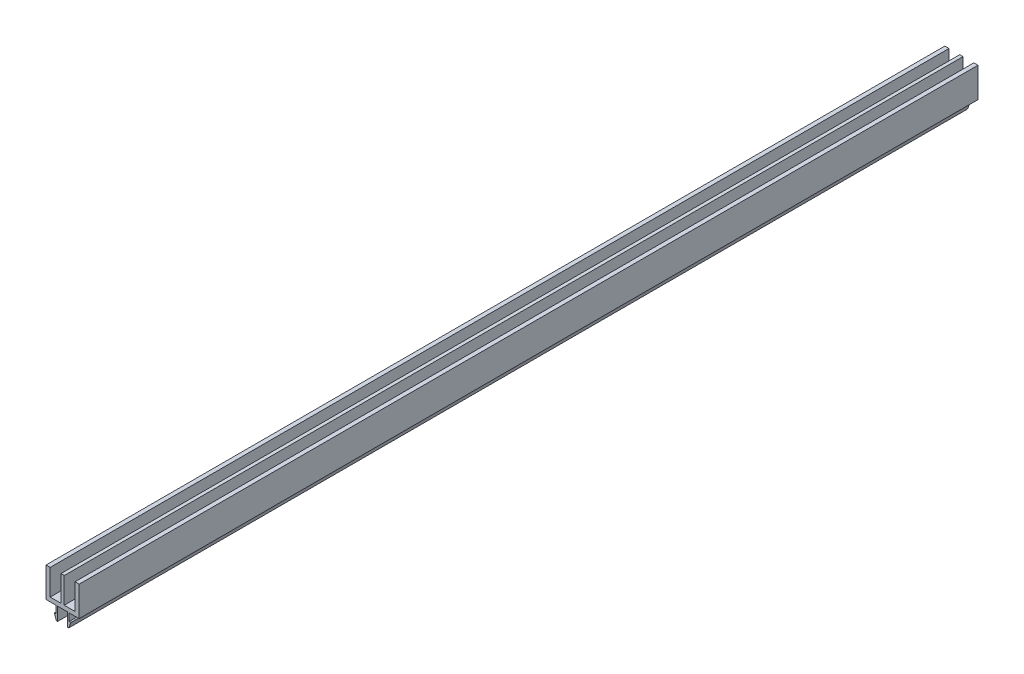
ISO-10303-21;
HEADER;
FILE_DESCRIPTION(('STEP AP214'),'2;1');
FILE_NAME('part.step','',(''),(''),'','','');
FILE_SCHEMA(('AUTOMOTIVE_DESIGN { 1 0 10303 214 1 1 1 1 }'));
ENDSEC;
DATA;
#1=APPLICATION_CONTEXT('core data for automotive mechanical design processes');
#2=APPLICATION_PROTOCOL_DEFINITION('international standard','automotive_design',2000,#1);
#3=PRODUCT_CONTEXT('',#1,'mechanical');
#4=PRODUCT('Part','Part','',(#3));
#5=PRODUCT_RELATED_PRODUCT_CATEGORY('part','',(#4));
#6=PRODUCT_DEFINITION_FORMATION('','',#4);
#7=PRODUCT_DEFINITION_CONTEXT('part definition',#1,'design');
#8=PRODUCT_DEFINITION('design','',#6,#7);
#9=PRODUCT_DEFINITION_SHAPE('','',#8);
#10=(LENGTH_UNIT() NAMED_UNIT(*) SI_UNIT(.MILLI.,.METRE.));
#11=(NAMED_UNIT(*) PLANE_ANGLE_UNIT() SI_UNIT($,.RADIAN.));
#12=(NAMED_UNIT(*) SI_UNIT($,.STERADIAN.) SOLID_ANGLE_UNIT());
#13=UNCERTAINTY_MEASURE_WITH_UNIT(LENGTH_MEASURE(1.E-05),#10,'distance_accuracy_value','');
#14=(GEOMETRIC_REPRESENTATION_CONTEXT(3) GLOBAL_UNCERTAINTY_ASSIGNED_CONTEXT((#13)) GLOBAL_UNIT_ASSIGNED_CONTEXT((#10,
#11,#12)) REPRESENTATION_CONTEXT('',''));
#15=CARTESIAN_POINT('',(0.,0.,0.));
#16=DIRECTION('',(0.,0.,1.));
#17=DIRECTION('',(1.,0.,0.));
#18=AXIS2_PLACEMENT_3D('',#15,#16,#17);
#19=CARTESIAN_POINT('',(-1.,17.9999999975,-492.));
#20=DIRECTION('',(-1.,0.,0.));
#21=DIRECTION('',(0.,-1.,0.));
#22=AXIS2_PLACEMENT_3D('',#19,#20,#21);
#23=PLANE('',#22);
#24=DIRECTION('',(0.,-1.,0.));
#25=VECTOR('',#24,1.);
#26=CARTESIAN_POINT('',(-1.,17.9999999975,50.));
#27=LINE('',#26,#25);
#28=CARTESIAN_POINT('',(-1.,17.9999999975,50.));
#29=VERTEX_POINT('',#28);
#30=CARTESIAN_POINT('',(-1.,2.4999999995,50.));
#31=VERTEX_POINT('',#30);
#32=EDGE_CURVE('E225',#29,#31,#27,.T.);
#33=ORIENTED_EDGE('',*,*,#32,.F.);
#34=DIRECTION('',(0.,0.,1.));
#35=VECTOR('',#34,1.);
#36=CARTESIAN_POINT('',(-1.,17.9999999975,-492.));
#37=LINE('',#36,#35);
#38=CARTESIAN_POINT('',(-1.,17.9999999975,-492.));
#39=VERTEX_POINT('',#38);
#40=EDGE_CURVE('E11',#39,#29,#37,.T.);
#41=ORIENTED_EDGE('',*,*,#40,.F.);
#42=DIRECTION('',(0.,-1.,0.));
#43=VECTOR('',#42,1.);
#44=CARTESIAN_POINT('',(-1.,17.9999999975,-492.));
#45=LINE('',#44,#43);
#46=CARTESIAN_POINT('',(-1.,2.4999999995,-492.));
#47=VERTEX_POINT('',#46);
#48=EDGE_CURVE('E293',#39,#47,#45,.T.);
#49=ORIENTED_EDGE('',*,*,#48,.T.);
#50=DIRECTION('',(0.,0.,1.));
#51=VECTOR('',#50,1.);
#52=CARTESIAN_POINT('',(-1.,2.4999999995,-492.));
#53=LINE('',#52,#51);
#54=EDGE_CURVE('E35',#47,#31,#53,.T.);
#55=ORIENTED_EDGE('',*,*,#54,.T.);
#56=EDGE_LOOP('',(#33,#41,#49,#55));
#57=FACE_BOUND('',#56,.T.);
#58=ADVANCED_FACE('F32',(#57),#23,.T.);
#59=CARTESIAN_POINT('',(0.999999999999998,17.9999999975,-492.));
#60=DIRECTION('',(0.,1.,0.));
#61=DIRECTION('',(0.,0.,1.));
#62=AXIS2_PLACEMENT_3D('',#59,#60,#61);
#63=PLANE('',#62);
#64=DIRECTION('',(-1.,0.,0.));
#65=VECTOR('',#64,1.);
#66=CARTESIAN_POINT('',(0.999999999999998,17.9999999975,50.));
#67=LINE('',#66,#65);
#68=CARTESIAN_POINT('',(0.999999999999998,17.9999999975,50.));
#69=VERTEX_POINT('',#68);
#70=EDGE_CURVE('E291',#69,#29,#67,.T.);
#71=ORIENTED_EDGE('',*,*,#70,.F.);
#72=DIRECTION('',(0.,0.,1.));
#73=VECTOR('',#72,1.);
#74=CARTESIAN_POINT('',(0.999999999999998,17.9999999975,-492.));
#75=LINE('',#74,#73);
#76=CARTESIAN_POINT('',(0.999999999999998,17.9999999975,-492.));
#77=VERTEX_POINT('',#76);
#78=EDGE_CURVE('E41',#77,#69,#75,.T.);
#79=ORIENTED_EDGE('',*,*,#78,.F.);
#80=DIRECTION('',(-1.,0.,0.));
#81=VECTOR('',#80,1.);
#82=CARTESIAN_POINT('',(0.999999999999998,17.9999999975,-492.));
#83=LINE('',#82,#81);
#84=EDGE_CURVE('E215',#77,#39,#83,.T.);
#85=ORIENTED_EDGE('',*,*,#84,.T.);
#86=ORIENTED_EDGE('',*,*,#40,.T.);
#87=EDGE_LOOP('',(#71,#79,#85,#86));
#88=FACE_BOUND('',#87,.T.);
#89=ADVANCED_FACE('F337',(#88),#63,.T.);
#90=CARTESIAN_POINT('',(0.999999999999998,2.4999999995,-492.));
#91=DIRECTION('',(1.,0.,0.));
#92=DIRECTION('',(0.,0.,-1.));
#93=AXIS2_PLACEMENT_3D('',#90,#91,#92);
#94=PLANE('',#93);
#95=DIRECTION('',(0.,1.,0.));
#96=VECTOR('',#95,1.);
#97=CARTESIAN_POINT('',(0.999999999999998,2.4999999995,50.));
#98=LINE('',#97,#96);
#99=CARTESIAN_POINT('',(0.999999999999998,2.4999999995,50.));
#100=VERTEX_POINT('',#99);
#101=EDGE_CURVE('E202',#100,#69,#98,.T.);
#102=ORIENTED_EDGE('',*,*,#101,.F.);
#103=DIRECTION('',(0.,0.,1.));
#104=VECTOR('',#103,1.);
#105=CARTESIAN_POINT('',(0.999999999999998,2.4999999995,-492.));
#106=LINE('',#105,#104);
#107=CARTESIAN_POINT('',(0.999999999999998,2.4999999995,-492.));
#108=VERTEX_POINT('',#107);
#109=EDGE_CURVE('E197',#108,#100,#106,.T.);
#110=ORIENTED_EDGE('',*,*,#109,.F.);
#111=DIRECTION('',(0.,1.,0.));
#112=VECTOR('',#111,1.);
#113=CARTESIAN_POINT('',(0.999999999999998,2.4999999995,-492.));
#114=LINE('',#113,#112);
#115=EDGE_CURVE('E200',#108,#77,#114,.T.);
#116=ORIENTED_EDGE('',*,*,#115,.T.);
#117=ORIENTED_EDGE('',*,*,#78,.T.);
#118=EDGE_LOOP('',(#102,#110,#116,#117));
#119=FACE_BOUND('',#118,.T.);
#120=ADVANCED_FACE('F199',(#119),#94,.T.);
#121=CARTESIAN_POINT('',(7.5,2.4999999995,-492.));
#122=DIRECTION('',(0.,1.,0.));
#123=DIRECTION('',(-1.,0.,0.));
#124=AXIS2_PLACEMENT_3D('',#121,#122,#123);
#125=PLANE('',#124);
#126=DIRECTION('',(-1.,0.,0.));
#127=VECTOR('',#126,1.);
#128=CARTESIAN_POINT('',(7.5,2.4999999995,50.));
#129=LINE('',#128,#127);
#130=CARTESIAN_POINT('',(7.5,2.4999999995,50.));
#131=VERTEX_POINT('',#130);
#132=EDGE_CURVE('E288',#131,#100,#129,.T.);
#133=ORIENTED_EDGE('',*,*,#132,.F.);
#134=DIRECTION('',(0.,0.,1.));
#135=VECTOR('',#134,1.);
#136=CARTESIAN_POINT('',(7.5,2.4999999995,-492.));
#137=LINE('',#136,#135);
#138=CARTESIAN_POINT('',(7.5,2.4999999995,-492.));
#139=VERTEX_POINT('',#138);
#140=EDGE_CURVE('E207',#139,#131,#137,.T.);
#141=ORIENTED_EDGE('',*,*,#140,.F.);
#142=DIRECTION('',(-1.,0.,0.));
#143=VECTOR('',#142,1.);
#144=CARTESIAN_POINT('',(7.5,2.4999999995,-492.));
#145=LINE('',#144,#143);
#146=EDGE_CURVE('E213',#139,#108,#145,.T.);
#147=ORIENTED_EDGE('',*,*,#146,.T.);
#148=ORIENTED_EDGE('',*,*,#109,.T.);
#149=EDGE_LOOP('',(#133,#141,#147,#148));
#150=FACE_BOUND('',#149,.T.);
#151=ADVANCED_FACE('F217',(#150),#125,.T.);
#152=CARTESIAN_POINT('',(7.5,17.9999999975,-492.));
#153=DIRECTION('',(-1.,0.,0.));
#154=DIRECTION('',(0.,-1.,0.));
#155=AXIS2_PLACEMENT_3D('',#152,#153,#154);
#156=PLANE('',#155);
#157=DIRECTION('',(0.,-1.,0.));
#158=VECTOR('',#157,1.);
#159=CARTESIAN_POINT('',(7.5,17.9999999975,50.));
#160=LINE('',#159,#158);
#161=CARTESIAN_POINT('',(7.5,17.9999999975,50.));
#162=VERTEX_POINT('',#161);
#163=EDGE_CURVE('E285',#162,#131,#160,.T.);
#164=ORIENTED_EDGE('',*,*,#163,.F.);
#165=DIRECTION('',(0.,0.,1.));
#166=VECTOR('',#165,1.);
#167=CARTESIAN_POINT('',(7.5,17.9999999975,-492.));
#168=LINE('',#167,#166);
#169=CARTESIAN_POINT('',(7.5,17.9999999975,-492.));
#170=VERTEX_POINT('',#169);
#171=EDGE_CURVE('E297',#170,#162,#168,.T.);
#172=ORIENTED_EDGE('',*,*,#171,.F.);
#173=DIRECTION('',(0.,-1.,0.));
#174=VECTOR('',#173,1.);
#175=CARTESIAN_POINT('',(7.5,17.9999999975,-492.));
#176=LINE('',#175,#174);
#177=EDGE_CURVE('E218',#170,#139,#176,.T.);
#178=ORIENTED_EDGE('',*,*,#177,.T.);
#179=ORIENTED_EDGE('',*,*,#140,.T.);
#180=EDGE_LOOP('',(#164,#172,#178,#179));
#181=FACE_BOUND('',#180,.T.);
#182=ADVANCED_FACE('F350',(#181),#156,.T.);
#183=CARTESIAN_POINT('',(10.,17.9999999975,-492.));
#184=DIRECTION('',(0.,1.,0.));
#185=DIRECTION('',(0.,0.,1.));
#186=AXIS2_PLACEMENT_3D('',#183,#184,#185);
#187=PLANE('',#186);
#188=DIRECTION('',(-1.,0.,0.));
#189=VECTOR('',#188,1.);
#190=CARTESIAN_POINT('',(10.,17.9999999975,50.));
#191=LINE('',#190,#189);
#192=CARTESIAN_POINT('',(10.,17.9999999975,50.));
#193=VERTEX_POINT('',#192);
#194=EDGE_CURVE('E282',#193,#162,#191,.T.);
#195=ORIENTED_EDGE('',*,*,#194,.F.);
#196=DIRECTION('',(0.,0.,1.));
#197=VECTOR('',#196,1.);
#198=CARTESIAN_POINT('',(10.,17.9999999975,-492.));
#199=LINE('',#198,#197);
#200=CARTESIAN_POINT('',(10.,17.9999999975,-492.));
#201=VERTEX_POINT('',#200);
#202=EDGE_CURVE('E299',#201,#193,#199,.T.);
#203=ORIENTED_EDGE('',*,*,#202,.F.);
#204=DIRECTION('',(-1.,0.,0.));
#205=VECTOR('',#204,1.);
#206=CARTESIAN_POINT('',(10.,17.9999999975,-492.));
#207=LINE('',#206,#205);
#208=EDGE_CURVE('E220',#201,#170,#207,.T.);
#209=ORIENTED_EDGE('',*,*,#208,.T.);
#210=ORIENTED_EDGE('',*,*,#171,.T.);
#211=EDGE_LOOP('',(#195,#203,#209,#210));
#212=FACE_BOUND('',#211,.T.);
#213=ADVANCED_FACE('F353',(#212),#187,.T.);
#214=CARTESIAN_POINT('',(10.,-4.99999828349541E-10,-492.));
#215=DIRECTION('',(1.,0.,0.));
#216=DIRECTION('',(0.,0.,-1.));
#217=AXIS2_PLACEMENT_3D('',#214,#215,#216);
#218=PLANE('',#217);
#219=DIRECTION('',(0.,1.,0.));
#220=VECTOR('',#219,1.);
#221=CARTESIAN_POINT('',(10.,-4.99999828349541E-10,50.));
#222=LINE('',#221,#220);
#223=CARTESIAN_POINT('',(10.,-4.99999828349541E-10,50.));
#224=VERTEX_POINT('',#223);
#225=EDGE_CURVE('E279',#224,#193,#222,.T.);
#226=ORIENTED_EDGE('',*,*,#225,.F.);
#227=DIRECTION('',(0.,0.,1.));
#228=VECTOR('',#227,1.);
#229=CARTESIAN_POINT('',(10.,-4.99999828349541E-10,-492.));
#230=LINE('',#229,#228);
#231=CARTESIAN_POINT('',(10.,-4.99999828349541E-10,-492.));
#232=VERTEX_POINT('',#231);
#233=EDGE_CURVE('E301',#232,#224,#230,.T.);
#234=ORIENTED_EDGE('',*,*,#233,.F.);
#235=DIRECTION('',(0.,1.,0.));
#236=VECTOR('',#235,1.);
#237=CARTESIAN_POINT('',(10.,-4.99999828349541E-10,-492.));
#238=LINE('',#237,#236);
#239=EDGE_CURVE('E643',#232,#201,#238,.T.);
#240=ORIENTED_EDGE('',*,*,#239,.T.);
#241=ORIENTED_EDGE('',*,*,#202,.T.);
#242=EDGE_LOOP('',(#226,#234,#240,#241));
#243=FACE_BOUND('',#242,.T.);
#244=ADVANCED_FACE('F357',(#243),#218,.T.);
#245=CARTESIAN_POINT('',(4.,-4.99999998002099E-10,-492.));
#246=DIRECTION('',(0.,-1.,0.));
#247=DIRECTION('',(1.,0.,0.));
#248=AXIS2_PLACEMENT_3D('',#245,#246,#247);
#249=PLANE('',#248);
#250=DIRECTION('',(1.,0.,0.));
#251=VECTOR('',#250,1.);
#252=CARTESIAN_POINT('',(4.,-4.99999998002099E-10,50.));
#253=LINE('',#252,#251);
#254=CARTESIAN_POINT('',(4.,-4.99999998002099E-10,50.));
#255=VERTEX_POINT('',#254);
#256=EDGE_CURVE('E276',#255,#224,#253,.T.);
#257=ORIENTED_EDGE('',*,*,#256,.F.);
#258=DIRECTION('',(0.,0.,1.));
#259=VECTOR('',#258,1.);
#260=CARTESIAN_POINT('',(4.,-4.99999998002099E-10,-492.));
#261=LINE('',#260,#259);
#262=CARTESIAN_POINT('',(4.,-4.99999998002099E-10,-492.));
#263=VERTEX_POINT('',#262);
#264=EDGE_CURVE('E303',#263,#255,#261,.T.);
#265=ORIENTED_EDGE('',*,*,#264,.F.);
#266=DIRECTION('',(1.,0.,0.));
#267=VECTOR('',#266,1.);
#268=CARTESIAN_POINT('',(4.,-4.99999998002099E-10,-492.));
#269=LINE('',#268,#267);
#270=EDGE_CURVE('E647',#263,#232,#269,.T.);
#271=ORIENTED_EDGE('',*,*,#270,.T.);
#272=ORIENTED_EDGE('',*,*,#233,.T.);
#273=EDGE_LOOP('',(#257,#265,#271,#272));
#274=FACE_BOUND('',#273,.T.);
#275=ADVANCED_FACE('F361',(#274),#249,.T.);
#276=CARTESIAN_POINT('',(4.,-4.5,-492.));
#277=DIRECTION('',(1.,0.,0.));
#278=DIRECTION('',(0.,0.,-1.));
#279=AXIS2_PLACEMENT_3D('',#276,#277,#278);
#280=PLANE('',#279);
#281=DIRECTION('',(0.,1.,0.));
#282=VECTOR('',#281,1.);
#283=CARTESIAN_POINT('',(4.,-4.5,50.));
#284=LINE('',#283,#282);
#285=CARTESIAN_POINT('',(4.,-4.5,50.));
#286=VERTEX_POINT('',#285);
#287=EDGE_CURVE('E273',#286,#255,#284,.T.);
#288=ORIENTED_EDGE('',*,*,#287,.F.);
#289=DIRECTION('',(0.,0.,1.));
#290=VECTOR('',#289,1.);
#291=CARTESIAN_POINT('',(4.,-4.5,-492.));
#292=LINE('',#291,#290);
#293=CARTESIAN_POINT('',(4.,-4.5,-492.));
#294=VERTEX_POINT('',#293);
#295=EDGE_CURVE('E305',#294,#286,#292,.T.);
#296=ORIENTED_EDGE('',*,*,#295,.F.);
#297=DIRECTION('',(0.,1.,0.));
#298=VECTOR('',#297,1.);
#299=CARTESIAN_POINT('',(4.,-4.5,-492.));
#300=LINE('',#299,#298);
#301=EDGE_CURVE('E636',#294,#263,#300,.T.);
#302=ORIENTED_EDGE('',*,*,#301,.T.);
#303=ORIENTED_EDGE('',*,*,#264,.T.);
#304=EDGE_LOOP('',(#288,#296,#302,#303));
#305=FACE_BOUND('',#304,.T.);
#306=ADVANCED_FACE('F365',(#305),#280,.T.);
#307=CARTESIAN_POINT('',(5.,-4.5,-492.));
#308=DIRECTION('',(0.,1.,0.));
#309=DIRECTION('',(0.,0.,1.));
#310=AXIS2_PLACEMENT_3D('',#307,#308,#309);
#311=PLANE('',#310);
#312=DIRECTION('',(-1.,0.,0.));
#313=VECTOR('',#312,1.);
#314=CARTESIAN_POINT('',(5.,-4.5,50.));
#315=LINE('',#314,#313);
#316=CARTESIAN_POINT('',(5.,-4.5,50.));
#317=VERTEX_POINT('',#316);
#318=EDGE_CURVE('E270',#317,#286,#315,.T.);
#319=ORIENTED_EDGE('',*,*,#318,.F.);
#320=DIRECTION('',(0.,0.,1.));
#321=VECTOR('',#320,1.);
#322=CARTESIAN_POINT('',(5.,-4.5,-492.));
#323=LINE('',#322,#321);
#324=CARTESIAN_POINT('',(5.,-4.5,-492.));
#325=VERTEX_POINT('',#324);
#326=EDGE_CURVE('E307',#325,#317,#323,.T.);
#327=ORIENTED_EDGE('',*,*,#326,.F.);
#328=DIRECTION('',(-1.,0.,0.));
#329=VECTOR('',#328,1.);
#330=CARTESIAN_POINT('',(5.,-4.5,-492.));
#331=LINE('',#330,#329);
#332=EDGE_CURVE('E632',#325,#294,#331,.T.);
#333=ORIENTED_EDGE('',*,*,#332,.T.);
#334=ORIENTED_EDGE('',*,*,#295,.T.);
#335=EDGE_LOOP('',(#319,#327,#333,#334));
#336=FACE_BOUND('',#335,.T.);
#337=ADVANCED_FACE('F369',(#336),#311,.T.);
#338=CARTESIAN_POINT('',(3.75,-8.,-492.));
#339=DIRECTION('',(0.941741911594837,-0.336336396998156,0.));
#340=DIRECTION('',(0.336336396998157,0.941741911594838,0.));
#341=AXIS2_PLACEMENT_3D('',#338,#339,#340);
#342=PLANE('',#341);
#343=DIRECTION('',(0.336336396998157,0.941741911594837,0.));
#344=VECTOR('',#343,1.);
#345=CARTESIAN_POINT('',(3.75,-8.,50.));
#346=LINE('',#345,#344);
#347=CARTESIAN_POINT('',(3.75,-8.,50.));
#348=VERTEX_POINT('',#347);
#349=EDGE_CURVE('E267',#348,#317,#346,.T.);
#350=ORIENTED_EDGE('',*,*,#349,.F.);
#351=DIRECTION('',(0.,0.,1.));
#352=VECTOR('',#351,1.);
#353=CARTESIAN_POINT('',(3.75,-8.,-492.));
#354=LINE('',#353,#352);
#355=CARTESIAN_POINT('',(3.75,-8.,-492.));
#356=VERTEX_POINT('',#355);
#357=EDGE_CURVE('E309',#356,#348,#354,.T.);
#358=ORIENTED_EDGE('',*,*,#357,.F.);
#359=DIRECTION('',(0.336336396998157,0.941741911594837,0.));
#360=VECTOR('',#359,1.);
#361=CARTESIAN_POINT('',(3.75,-8.,-492.));
#362=LINE('',#361,#360);
#363=EDGE_CURVE('E653',#356,#325,#362,.T.);
#364=ORIENTED_EDGE('',*,*,#363,.T.);
#365=ORIENTED_EDGE('',*,*,#326,.T.);
#366=EDGE_LOOP('',(#350,#358,#364,#365));
#367=FACE_BOUND('',#366,.T.);
#368=ADVANCED_FACE('F373',(#367),#342,.T.);
#369=CARTESIAN_POINT('',(3.,-8.,-492.));
#370=DIRECTION('',(0.,-1.,0.));
#371=DIRECTION('',(0.,0.,-1.));
#372=AXIS2_PLACEMENT_3D('',#369,#370,#371);
#373=PLANE('',#372);
#374=DIRECTION('',(1.,0.,0.));
#375=VECTOR('',#374,1.);
#376=CARTESIAN_POINT('',(3.,-8.,50.));
#377=LINE('',#376,#375);
#378=CARTESIAN_POINT('',(3.,-8.,50.));
#379=VERTEX_POINT('',#378);
#380=EDGE_CURVE('E264',#379,#348,#377,.T.);
#381=ORIENTED_EDGE('',*,*,#380,.F.);
#382=DIRECTION('',(0.,0.,1.));
#383=VECTOR('',#382,1.);
#384=CARTESIAN_POINT('',(3.,-8.,-492.));
#385=LINE('',#384,#383);
#386=CARTESIAN_POINT('',(3.,-8.,-492.));
#387=VERTEX_POINT('',#386);
#388=EDGE_CURVE('E311',#387,#379,#385,.T.);
#389=ORIENTED_EDGE('',*,*,#388,.F.);
#390=DIRECTION('',(1.,0.,0.));
#391=VECTOR('',#390,1.);
#392=CARTESIAN_POINT('',(3.,-8.,-492.));
#393=LINE('',#392,#391);
#394=EDGE_CURVE('E625',#387,#356,#393,.T.);
#395=ORIENTED_EDGE('',*,*,#394,.T.);
#396=ORIENTED_EDGE('',*,*,#357,.T.);
#397=EDGE_LOOP('',(#381,#389,#395,#396));
#398=FACE_BOUND('',#397,.T.);
#399=ADVANCED_FACE('F377',(#398),#373,.T.);
#400=CARTESIAN_POINT('',(3.,-4.9999985194348E-10,-492.));
#401=DIRECTION('',(-1.,0.,0.));
#402=DIRECTION('',(0.,0.,1.));
#403=AXIS2_PLACEMENT_3D('',#400,#401,#402);
#404=PLANE('',#403);
#405=DIRECTION('',(0.,-1.,0.));
#406=VECTOR('',#405,1.);
#407=CARTESIAN_POINT('',(3.,-4.9999985194348E-10,50.));
#408=LINE('',#407,#406);
#409=CARTESIAN_POINT('',(3.,-4.9999985194348E-10,50.));
#410=VERTEX_POINT('',#409);
#411=EDGE_CURVE('E261',#410,#379,#408,.T.);
#412=ORIENTED_EDGE('',*,*,#411,.F.);
#413=DIRECTION('',(0.,0.,1.));
#414=VECTOR('',#413,1.);
#415=CARTESIAN_POINT('',(3.,-4.9999985194348E-10,-492.));
#416=LINE('',#415,#414);
#417=CARTESIAN_POINT('',(3.,-4.9999985194348E-10,-492.));
#418=VERTEX_POINT('',#417);
#419=EDGE_CURVE('E313',#418,#410,#416,.T.);
#420=ORIENTED_EDGE('',*,*,#419,.F.);
#421=DIRECTION('',(0.,-1.,0.));
#422=VECTOR('',#421,1.);
#423=CARTESIAN_POINT('',(3.,-4.9999985194348E-10,-492.));
#424=LINE('',#423,#422);
#425=EDGE_CURVE('E621',#418,#387,#424,.T.);
#426=ORIENTED_EDGE('',*,*,#425,.T.);
#427=ORIENTED_EDGE('',*,*,#388,.T.);
#428=EDGE_LOOP('',(#412,#420,#426,#427));
#429=FACE_BOUND('',#428,.T.);
#430=ADVANCED_FACE('F381',(#429),#404,.T.);
#431=CARTESIAN_POINT('',(-3.,-4.99999455901012E-10,-492.));
#432=DIRECTION('',(0.,-1.,0.));
#433=DIRECTION('',(1.,0.,0.));
#434=AXIS2_PLACEMENT_3D('',#431,#432,#433);
#435=PLANE('',#434);
#436=DIRECTION('',(1.,0.,0.));
#437=VECTOR('',#436,1.);
#438=CARTESIAN_POINT('',(-3.,-4.99999455901012E-10,50.));
#439=LINE('',#438,#437);
#440=CARTESIAN_POINT('',(-3.,-4.99999455901012E-10,50.));
#441=VERTEX_POINT('',#440);
#442=EDGE_CURVE('E258',#441,#410,#439,.T.);
#443=ORIENTED_EDGE('',*,*,#442,.F.);
#444=DIRECTION('',(0.,0.,1.));
#445=VECTOR('',#444,1.);
#446=CARTESIAN_POINT('',(-3.,-4.99999455901012E-10,-492.));
#447=LINE('',#446,#445);
#448=CARTESIAN_POINT('',(-3.,-4.99999455901012E-10,-492.));
#449=VERTEX_POINT('',#448);
#450=EDGE_CURVE('E315',#449,#441,#447,.T.);
#451=ORIENTED_EDGE('',*,*,#450,.F.);
#452=DIRECTION('',(1.,0.,0.));
#453=VECTOR('',#452,1.);
#454=CARTESIAN_POINT('',(-3.,-4.99999455901012E-10,-492.));
#455=LINE('',#454,#453);
#456=EDGE_CURVE('E657',#449,#418,#455,.T.);
#457=ORIENTED_EDGE('',*,*,#456,.T.);
#458=ORIENTED_EDGE('',*,*,#419,.T.);
#459=EDGE_LOOP('',(#443,#451,#457,#458));
#460=FACE_BOUND('',#459,.T.);
#461=ADVANCED_FACE('F385',(#460),#435,.T.);
#462=CARTESIAN_POINT('',(-3.,-8.,-492.));
#463=DIRECTION('',(1.,0.,0.));
#464=DIRECTION('',(0.,0.,-1.));
#465=AXIS2_PLACEMENT_3D('',#462,#463,#464);
#466=PLANE('',#465);
#467=DIRECTION('',(0.,1.,0.));
#468=VECTOR('',#467,1.);
#469=CARTESIAN_POINT('',(-3.,-8.,50.));
#470=LINE('',#469,#468);
#471=CARTESIAN_POINT('',(-3.,-8.,50.));
#472=VERTEX_POINT('',#471);
#473=EDGE_CURVE('E255',#472,#441,#470,.T.);
#474=ORIENTED_EDGE('',*,*,#473,.F.);
#475=DIRECTION('',(0.,0.,1.));
#476=VECTOR('',#475,1.);
#477=CARTESIAN_POINT('',(-3.,-8.,-492.));
#478=LINE('',#477,#476);
#479=CARTESIAN_POINT('',(-3.,-8.,-492.));
#480=VERTEX_POINT('',#479);
#481=EDGE_CURVE('E317',#480,#472,#478,.T.);
#482=ORIENTED_EDGE('',*,*,#481,.F.);
#483=DIRECTION('',(0.,1.,0.));
#484=VECTOR('',#483,1.);
#485=CARTESIAN_POINT('',(-3.,-8.,-492.));
#486=LINE('',#485,#484);
#487=EDGE_CURVE('E614',#480,#449,#486,.T.);
#488=ORIENTED_EDGE('',*,*,#487,.T.);
#489=ORIENTED_EDGE('',*,*,#450,.T.);
#490=EDGE_LOOP('',(#474,#482,#488,#489));
#491=FACE_BOUND('',#490,.T.);
#492=ADVANCED_FACE('F389',(#491),#466,.T.);
#493=CARTESIAN_POINT('',(-3.75,-8.,-492.));
#494=DIRECTION('',(0.,-1.,0.));
#495=DIRECTION('',(0.,0.,-1.));
#496=AXIS2_PLACEMENT_3D('',#493,#494,#495);
#497=PLANE('',#496);
#498=DIRECTION('',(1.,0.,0.));
#499=VECTOR('',#498,1.);
#500=CARTESIAN_POINT('',(-3.75,-8.,50.));
#501=LINE('',#500,#499);
#502=CARTESIAN_POINT('',(-3.75,-8.,50.));
#503=VERTEX_POINT('',#502);
#504=EDGE_CURVE('E252',#503,#472,#501,.T.);
#505=ORIENTED_EDGE('',*,*,#504,.F.);
#506=DIRECTION('',(0.,0.,1.));
#507=VECTOR('',#506,1.);
#508=CARTESIAN_POINT('',(-3.75,-8.,-492.));
#509=LINE('',#508,#507);
#510=CARTESIAN_POINT('',(-3.75,-8.,-492.));
#511=VERTEX_POINT('',#510);
#512=EDGE_CURVE('E319',#511,#503,#509,.T.);
#513=ORIENTED_EDGE('',*,*,#512,.F.);
#514=DIRECTION('',(1.,0.,0.));
#515=VECTOR('',#514,1.);
#516=CARTESIAN_POINT('',(-3.75,-8.,-492.));
#517=LINE('',#516,#515);
#518=EDGE_CURVE('E610',#511,#480,#517,.T.);
#519=ORIENTED_EDGE('',*,*,#518,.T.);
#520=ORIENTED_EDGE('',*,*,#481,.T.);
#521=EDGE_LOOP('',(#505,#513,#519,#520));
#522=FACE_BOUND('',#521,.T.);
#523=ADVANCED_FACE('F393',(#522),#497,.T.);
#524=CARTESIAN_POINT('',(-5.,-4.5,-492.));
#525=DIRECTION('',(-0.941741911594838,-0.336336396998156,0.));
#526=DIRECTION('',(0.336336396998156,-0.941741911594838,0.));
#527=AXIS2_PLACEMENT_3D('',#524,#525,#526);
#528=PLANE('',#527);
#529=DIRECTION('',(0.336336396998156,-0.941741911594837,0.));
#530=VECTOR('',#529,1.);
#531=CARTESIAN_POINT('',(-5.,-4.5,50.));
#532=LINE('',#531,#530);
#533=CARTESIAN_POINT('',(-5.,-4.5,50.));
#534=VERTEX_POINT('',#533);
#535=EDGE_CURVE('E249',#534,#503,#532,.T.);
#536=ORIENTED_EDGE('',*,*,#535,.F.);
#537=DIRECTION('',(0.,0.,1.));
#538=VECTOR('',#537,1.);
#539=CARTESIAN_POINT('',(-5.,-4.5,-492.));
#540=LINE('',#539,#538);
#541=CARTESIAN_POINT('',(-5.,-4.5,-492.));
#542=VERTEX_POINT('',#541);
#543=EDGE_CURVE('E321',#542,#534,#540,.T.);
#544=ORIENTED_EDGE('',*,*,#543,.F.);
#545=DIRECTION('',(0.336336396998156,-0.941741911594837,0.));
#546=VECTOR('',#545,1.);
#547=CARTESIAN_POINT('',(-5.,-4.5,-492.));
#548=LINE('',#547,#546);
#549=EDGE_CURVE('E661',#542,#511,#548,.T.);
#550=ORIENTED_EDGE('',*,*,#549,.T.);
#551=ORIENTED_EDGE('',*,*,#512,.T.);
#552=EDGE_LOOP('',(#536,#544,#550,#551));
#553=FACE_BOUND('',#552,.T.);
#554=ADVANCED_FACE('F397',(#553),#528,.T.);
#555=CARTESIAN_POINT('',(-4.,-4.5,-492.));
#556=DIRECTION('',(0.,1.,0.));
#557=DIRECTION('',(0.,0.,1.));
#558=AXIS2_PLACEMENT_3D('',#555,#556,#557);
#559=PLANE('',#558);
#560=DIRECTION('',(-1.,0.,0.));
#561=VECTOR('',#560,1.);
#562=CARTESIAN_POINT('',(-4.,-4.5,50.));
#563=LINE('',#562,#561);
#564=CARTESIAN_POINT('',(-4.,-4.5,50.));
#565=VERTEX_POINT('',#564);
#566=EDGE_CURVE('E246',#565,#534,#563,.T.);
#567=ORIENTED_EDGE('',*,*,#566,.F.);
#568=DIRECTION('',(0.,0.,1.));
#569=VECTOR('',#568,1.);
#570=CARTESIAN_POINT('',(-4.,-4.5,-492.));
#571=LINE('',#570,#569);
#572=CARTESIAN_POINT('',(-4.,-4.5,-492.));
#573=VERTEX_POINT('',#572);
#574=EDGE_CURVE('E323',#573,#565,#571,.T.);
#575=ORIENTED_EDGE('',*,*,#574,.F.);
#576=DIRECTION('',(-1.,0.,0.));
#577=VECTOR('',#576,1.);
#578=CARTESIAN_POINT('',(-4.,-4.5,-492.));
#579=LINE('',#578,#577);
#580=EDGE_CURVE('E603',#573,#542,#579,.T.);
#581=ORIENTED_EDGE('',*,*,#580,.T.);
#582=ORIENTED_EDGE('',*,*,#543,.T.);
#583=EDGE_LOOP('',(#567,#575,#581,#582));
#584=FACE_BOUND('',#583,.T.);
#585=ADVANCED_FACE('F401',(#584),#559,.T.);
#586=CARTESIAN_POINT('',(-4.,-4.9999985194348E-10,-492.));
#587=DIRECTION('',(-1.,0.,0.));
#588=DIRECTION('',(0.,0.,1.));
#589=AXIS2_PLACEMENT_3D('',#586,#587,#588);
#590=PLANE('',#589);
#591=DIRECTION('',(0.,-1.,0.));
#592=VECTOR('',#591,1.);
#593=CARTESIAN_POINT('',(-4.,-4.9999985194348E-10,50.));
#594=LINE('',#593,#592);
#595=CARTESIAN_POINT('',(-4.,-4.9999985194348E-10,50.));
#596=VERTEX_POINT('',#595);
#597=EDGE_CURVE('E243',#596,#565,#594,.T.);
#598=ORIENTED_EDGE('',*,*,#597,.F.);
#599=DIRECTION('',(0.,0.,1.));
#600=VECTOR('',#599,1.);
#601=CARTESIAN_POINT('',(-4.,-4.9999985194348E-10,-492.));
#602=LINE('',#601,#600);
#603=CARTESIAN_POINT('',(-4.,-4.9999985194348E-10,-492.));
#604=VERTEX_POINT('',#603);
#605=EDGE_CURVE('E325',#604,#596,#602,.T.);
#606=ORIENTED_EDGE('',*,*,#605,.F.);
#607=DIRECTION('',(0.,-1.,0.));
#608=VECTOR('',#607,1.);
#609=CARTESIAN_POINT('',(-4.,-4.9999985194348E-10,-492.));
#610=LINE('',#609,#608);
#611=EDGE_CURVE('E599',#604,#573,#610,.T.);
#612=ORIENTED_EDGE('',*,*,#611,.T.);
#613=ORIENTED_EDGE('',*,*,#574,.T.);
#614=EDGE_LOOP('',(#598,#606,#612,#613));
#615=FACE_BOUND('',#614,.T.);
#616=ADVANCED_FACE('F405',(#615),#590,.T.);
#617=CARTESIAN_POINT('',(-10.,-4.99999719929324E-10,-492.));
#618=DIRECTION('',(0.,-1.,0.));
#619=DIRECTION('',(1.,0.,0.));
#620=AXIS2_PLACEMENT_3D('',#617,#618,#619);
#621=PLANE('',#620);
#622=DIRECTION('',(1.,0.,0.));
#623=VECTOR('',#622,1.);
#624=CARTESIAN_POINT('',(-10.,-4.99999719929324E-10,50.));
#625=LINE('',#624,#623);
#626=CARTESIAN_POINT('',(-10.,-4.99999719929324E-10,50.));
#627=VERTEX_POINT('',#626);
#628=EDGE_CURVE('E240',#627,#596,#625,.T.);
#629=ORIENTED_EDGE('',*,*,#628,.F.);
#630=DIRECTION('',(0.,0.,1.));
#631=VECTOR('',#630,1.);
#632=CARTESIAN_POINT('',(-10.,-4.99999719929324E-10,-492.));
#633=LINE('',#632,#631);
#634=CARTESIAN_POINT('',(-10.,-4.99999719929324E-10,-492.));
#635=VERTEX_POINT('',#634);
#636=EDGE_CURVE('E327',#635,#627,#633,.T.);
#637=ORIENTED_EDGE('',*,*,#636,.F.);
#638=DIRECTION('',(1.,0.,0.));
#639=VECTOR('',#638,1.);
#640=CARTESIAN_POINT('',(-10.,-4.99999719929324E-10,-492.));
#641=LINE('',#640,#639);
#642=EDGE_CURVE('E665',#635,#604,#641,.T.);
#643=ORIENTED_EDGE('',*,*,#642,.T.);
#644=ORIENTED_EDGE('',*,*,#605,.T.);
#645=EDGE_LOOP('',(#629,#637,#643,#644));
#646=FACE_BOUND('',#645,.T.);
#647=ADVANCED_FACE('F409',(#646),#621,.T.);
#648=CARTESIAN_POINT('',(-10.,17.9999999975,-492.));
#649=DIRECTION('',(-1.,0.,0.));
#650=DIRECTION('',(0.,-1.,0.));
#651=AXIS2_PLACEMENT_3D('',#648,#649,#650);
#652=PLANE('',#651);
#653=DIRECTION('',(0.,-1.,0.));
#654=VECTOR('',#653,1.);
#655=CARTESIAN_POINT('',(-10.,17.9999999975,50.));
#656=LINE('',#655,#654);
#657=CARTESIAN_POINT('',(-10.,17.9999999975,50.));
#658=VERTEX_POINT('',#657);
#659=EDGE_CURVE('E237',#658,#627,#656,.T.);
#660=ORIENTED_EDGE('',*,*,#659,.F.);
#661=DIRECTION('',(0.,0.,1.));
#662=VECTOR('',#661,1.);
#663=CARTESIAN_POINT('',(-10.,17.9999999975,-492.));
#664=LINE('',#663,#662);
#665=CARTESIAN_POINT('',(-10.,17.9999999975,-492.));
#666=VERTEX_POINT('',#665);
#667=EDGE_CURVE('E329',#666,#658,#664,.T.);
#668=ORIENTED_EDGE('',*,*,#667,.F.);
#669=DIRECTION('',(0.,-1.,0.));
#670=VECTOR('',#669,1.);
#671=CARTESIAN_POINT('',(-10.,17.9999999975,-492.));
#672=LINE('',#671,#670);
#673=EDGE_CURVE('E592',#666,#635,#672,.T.);
#674=ORIENTED_EDGE('',*,*,#673,.T.);
#675=ORIENTED_EDGE('',*,*,#636,.T.);
#676=EDGE_LOOP('',(#660,#668,#674,#675));
#677=FACE_BOUND('',#676,.T.);
#678=ADVANCED_FACE('F413',(#677),#652,.T.);
#679=CARTESIAN_POINT('',(-7.5,17.9999999975,-492.));
#680=DIRECTION('',(0.,1.,0.));
#681=DIRECTION('',(0.,0.,1.));
#682=AXIS2_PLACEMENT_3D('',#679,#680,#681);
#683=PLANE('',#682);
#684=DIRECTION('',(-1.,0.,0.));
#685=VECTOR('',#684,1.);
#686=CARTESIAN_POINT('',(-7.5,17.9999999975,50.));
#687=LINE('',#686,#685);
#688=CARTESIAN_POINT('',(-7.5,17.9999999975,50.));
#689=VERTEX_POINT('',#688);
#690=EDGE_CURVE('E234',#689,#658,#687,.T.);
#691=ORIENTED_EDGE('',*,*,#690,.F.);
#692=DIRECTION('',(0.,0.,1.));
#693=VECTOR('',#692,1.);
#694=CARTESIAN_POINT('',(-7.5,17.9999999975,-492.));
#695=LINE('',#694,#693);
#696=CARTESIAN_POINT('',(-7.5,17.9999999975,-492.));
#697=VERTEX_POINT('',#696);
#698=EDGE_CURVE('E331',#697,#689,#695,.T.);
#699=ORIENTED_EDGE('',*,*,#698,.F.);
#700=DIRECTION('',(-1.,0.,0.));
#701=VECTOR('',#700,1.);
#702=CARTESIAN_POINT('',(-7.5,17.9999999975,-492.));
#703=LINE('',#702,#701);
#704=EDGE_CURVE('E588',#697,#666,#703,.T.);
#705=ORIENTED_EDGE('',*,*,#704,.T.);
#706=ORIENTED_EDGE('',*,*,#667,.T.);
#707=EDGE_LOOP('',(#691,#699,#705,#706));
#708=FACE_BOUND('',#707,.T.);
#709=ADVANCED_FACE('F417',(#708),#683,.T.);
#710=CARTESIAN_POINT('',(-7.5,2.4999999995,-492.));
#711=DIRECTION('',(1.,0.,0.));
#712=DIRECTION('',(0.,0.,-1.));
#713=AXIS2_PLACEMENT_3D('',#710,#711,#712);
#714=PLANE('',#713);
#715=DIRECTION('',(0.,1.,0.));
#716=VECTOR('',#715,1.);
#717=CARTESIAN_POINT('',(-7.5,2.4999999995,50.));
#718=LINE('',#717,#716);
#719=CARTESIAN_POINT('',(-7.5,2.4999999995,50.));
#720=VERTEX_POINT('',#719);
#721=EDGE_CURVE('E231',#720,#689,#718,.T.);
#722=ORIENTED_EDGE('',*,*,#721,.F.);
#723=DIRECTION('',(0.,0.,1.));
#724=VECTOR('',#723,1.);
#725=CARTESIAN_POINT('',(-7.5,2.4999999995,-492.));
#726=LINE('',#725,#724);
#727=CARTESIAN_POINT('',(-7.5,2.4999999995,-492.));
#728=VERTEX_POINT('',#727);
#729=EDGE_CURVE('E332',#728,#720,#726,.T.);
#730=ORIENTED_EDGE('',*,*,#729,.F.);
#731=DIRECTION('',(0.,1.,0.));
#732=VECTOR('',#731,1.);
#733=CARTESIAN_POINT('',(-7.5,2.4999999995,-492.));
#734=LINE('',#733,#732);
#735=EDGE_CURVE('E669',#728,#697,#734,.T.);
#736=ORIENTED_EDGE('',*,*,#735,.T.);
#737=ORIENTED_EDGE('',*,*,#698,.T.);
#738=EDGE_LOOP('',(#722,#730,#736,#737));
#739=FACE_BOUND('',#738,.T.);
#740=ADVANCED_FACE('F421',(#739),#714,.T.);
#741=CARTESIAN_POINT('',(-1.,2.4999999995,-492.));
#742=DIRECTION('',(0.,1.,0.));
#743=DIRECTION('',(-1.,0.,0.));
#744=AXIS2_PLACEMENT_3D('',#741,#742,#743);
#745=PLANE('',#744);
#746=DIRECTION('',(-1.,0.,0.));
#747=VECTOR('',#746,1.);
#748=CARTESIAN_POINT('',(-1.,2.4999999995,50.));
#749=LINE('',#748,#747);
#750=EDGE_CURVE('E228',#31,#720,#749,.T.);
#751=ORIENTED_EDGE('',*,*,#750,.F.);
#752=ORIENTED_EDGE('',*,*,#54,.F.);
#753=DIRECTION('',(-1.,0.,0.));
#754=VECTOR('',#753,1.);
#755=CARTESIAN_POINT('',(-1.,2.4999999995,-492.));
#756=LINE('',#755,#754);
#757=EDGE_CURVE('E671',#47,#728,#756,.T.);
#758=ORIENTED_EDGE('',*,*,#757,.T.);
#759=ORIENTED_EDGE('',*,*,#729,.T.);
#760=EDGE_LOOP('',(#751,#752,#758,#759));
#761=FACE_BOUND('',#760,.T.);
#762=ADVANCED_FACE('F334',(#761),#745,.T.);
#763=CARTESIAN_POINT('',(0.,0.,-492.));
#764=DIRECTION('',(0.,0.,-1.));
#765=DIRECTION('',(-1.,0.,0.));
#766=AXIS2_PLACEMENT_3D('',#763,#764,#765);
#767=PLANE('',#766);
#768=ORIENTED_EDGE('',*,*,#48,.F.);
#769=ORIENTED_EDGE('',*,*,#84,.F.);
#770=ORIENTED_EDGE('',*,*,#115,.F.);
#771=ORIENTED_EDGE('',*,*,#146,.F.);
#772=ORIENTED_EDGE('',*,*,#177,.F.);
#773=ORIENTED_EDGE('',*,*,#208,.F.);
#774=ORIENTED_EDGE('',*,*,#239,.F.);
#775=ORIENTED_EDGE('',*,*,#270,.F.);
#776=ORIENTED_EDGE('',*,*,#301,.F.);
#777=ORIENTED_EDGE('',*,*,#332,.F.);
#778=ORIENTED_EDGE('',*,*,#363,.F.);
#779=ORIENTED_EDGE('',*,*,#394,.F.);
#780=ORIENTED_EDGE('',*,*,#425,.F.);
#781=ORIENTED_EDGE('',*,*,#456,.F.);
#782=ORIENTED_EDGE('',*,*,#487,.F.);
#783=ORIENTED_EDGE('',*,*,#518,.F.);
#784=ORIENTED_EDGE('',*,*,#549,.F.);
#785=ORIENTED_EDGE('',*,*,#580,.F.);
#786=ORIENTED_EDGE('',*,*,#611,.F.);
#787=ORIENTED_EDGE('',*,*,#642,.F.);
#788=ORIENTED_EDGE('',*,*,#673,.F.);
#789=ORIENTED_EDGE('',*,*,#704,.F.);
#790=ORIENTED_EDGE('',*,*,#735,.F.);
#791=ORIENTED_EDGE('',*,*,#757,.F.);
#792=EDGE_LOOP('',(#768,#769,#770,#771,#772,#773,#774,#775,#776,#777,#778,#779,#780,#781,#782,
#783,#784,#785,#786,#787,#788,#789,#790,#791));
#793=FACE_BOUND('',#792,.T.);
#794=ADVANCED_FACE('F211',(#793),#767,.T.);
#795=CARTESIAN_POINT('',(0.,0.,50.));
#796=DIRECTION('',(0.,0.,-1.));
#797=DIRECTION('',(-1.,0.,0.));
#798=AXIS2_PLACEMENT_3D('',#795,#796,#797);
#799=PLANE('',#798);
#800=ORIENTED_EDGE('',*,*,#32,.T.);
#801=ORIENTED_EDGE('',*,*,#750,.T.);
#802=ORIENTED_EDGE('',*,*,#721,.T.);
#803=ORIENTED_EDGE('',*,*,#690,.T.);
#804=ORIENTED_EDGE('',*,*,#659,.T.);
#805=ORIENTED_EDGE('',*,*,#628,.T.);
#806=ORIENTED_EDGE('',*,*,#597,.T.);
#807=ORIENTED_EDGE('',*,*,#566,.T.);
#808=ORIENTED_EDGE('',*,*,#535,.T.);
#809=ORIENTED_EDGE('',*,*,#504,.T.);
#810=ORIENTED_EDGE('',*,*,#473,.T.);
#811=ORIENTED_EDGE('',*,*,#442,.T.);
#812=ORIENTED_EDGE('',*,*,#411,.T.);
#813=ORIENTED_EDGE('',*,*,#380,.T.);
#814=ORIENTED_EDGE('',*,*,#349,.T.);
#815=ORIENTED_EDGE('',*,*,#318,.T.);
#816=ORIENTED_EDGE('',*,*,#287,.T.);
#817=ORIENTED_EDGE('',*,*,#256,.T.);
#818=ORIENTED_EDGE('',*,*,#225,.T.);
#819=ORIENTED_EDGE('',*,*,#194,.T.);
#820=ORIENTED_EDGE('',*,*,#163,.T.);
#821=ORIENTED_EDGE('',*,*,#132,.T.);
#822=ORIENTED_EDGE('',*,*,#101,.T.);
#823=ORIENTED_EDGE('',*,*,#70,.T.);
#824=EDGE_LOOP('',(#800,#801,#802,#803,#804,#805,#806,#807,#808,#809,#810,#811,#812,#813,#814,
#815,#816,#817,#818,#819,#820,#821,#822,#823));
#825=FACE_BOUND('',#824,.T.);
#826=ADVANCED_FACE('F336',(#825),#799,.F.);
#827=CLOSED_SHELL('',(#58,#89,#120,#151,#182,#213,#244,#275,#306,#337,#368,#399,#430,#461,#492,
#523,#554,#585,#616,#647,#678,#709,#740,#762,#794,#826));
#828=MANIFOLD_SOLID_BREP('B2',#827);
#829=ADVANCED_BREP_SHAPE_REPRESENTATION('',(#18,#828),#14);
#830=SHAPE_DEFINITION_REPRESENTATION(#9,#829);
ENDSEC;
END-ISO-10303-21;
